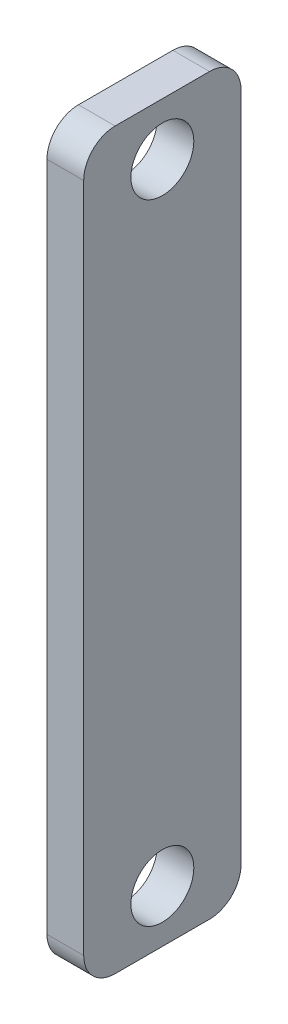
ISO-10303-21;
HEADER;
FILE_DESCRIPTION(('STEP AP214'),'2;1');
FILE_NAME('part.step','',(''),(''),'','','');
FILE_SCHEMA(('AUTOMOTIVE_DESIGN { 1 0 10303 214 1 1 1 1 }'));
ENDSEC;
DATA;
#1=APPLICATION_CONTEXT('core data for automotive mechanical design processes');
#2=APPLICATION_PROTOCOL_DEFINITION('international standard','automotive_design',2000,#1);
#3=PRODUCT_CONTEXT('',#1,'mechanical');
#4=PRODUCT('Part','Part','',(#3));
#5=PRODUCT_RELATED_PRODUCT_CATEGORY('part','',(#4));
#6=PRODUCT_DEFINITION_FORMATION('','',#4);
#7=PRODUCT_DEFINITION_CONTEXT('part definition',#1,'design');
#8=PRODUCT_DEFINITION('design','',#6,#7);
#9=PRODUCT_DEFINITION_SHAPE('','',#8);
#10=(LENGTH_UNIT() NAMED_UNIT(*) SI_UNIT(.MILLI.,.METRE.));
#11=(NAMED_UNIT(*) PLANE_ANGLE_UNIT() SI_UNIT($,.RADIAN.));
#12=(NAMED_UNIT(*) SI_UNIT($,.STERADIAN.) SOLID_ANGLE_UNIT());
#13=UNCERTAINTY_MEASURE_WITH_UNIT(LENGTH_MEASURE(1.E-05),#10,'distance_accuracy_value','');
#14=(GEOMETRIC_REPRESENTATION_CONTEXT(3) GLOBAL_UNCERTAINTY_ASSIGNED_CONTEXT((#13)) GLOBAL_UNIT_ASSIGNED_CONTEXT((#10,
#11,#12)) REPRESENTATION_CONTEXT('',''));
#15=CARTESIAN_POINT('',(0.,0.,0.));
#16=DIRECTION('',(0.,0.,1.));
#17=DIRECTION('',(1.,0.,0.));
#18=AXIS2_PLACEMENT_3D('',#15,#16,#17);
#19=CARTESIAN_POINT('',(1.75,-67.,-3.00000000000001));
#20=DIRECTION('',(1.,0.,0.));
#21=DIRECTION('',(0.,0.,-1.));
#22=AXIS2_PLACEMENT_3D('',#19,#20,#21);
#23=PLANE('',#22);
#24=CARTESIAN_POINT('',(1.75,-5.,-7.5));
#25=DIRECTION('',(1.,0.,0.));
#26=DIRECTION('',(0.,0.,-1.));
#27=AXIS2_PLACEMENT_3D('',#24,#25,#26);
#28=CIRCLE('',#27,3.);
#29=CARTESIAN_POINT('',(1.75,-5.,-10.5));
#30=VERTEX_POINT('',#29);
#31=EDGE_CURVE('E134',#30,#30,#28,.T.);
#32=ORIENTED_EDGE('',*,*,#31,.F.);
#33=EDGE_LOOP('',(#32));
#34=FACE_BOUND('',#33,.T.);
#35=CARTESIAN_POINT('',(1.75,-67.,-3.00000000000001));
#36=DIRECTION('',(1.,0.,0.));
#37=DIRECTION('',(0.,0.,-1.));
#38=AXIS2_PLACEMENT_3D('',#35,#36,#37);
#39=CIRCLE('',#38,3.);
#40=CARTESIAN_POINT('',(1.75,-67.,0.));
#41=VERTEX_POINT('',#40);
#42=CARTESIAN_POINT('',(1.75,-70.,-3.00000000000001));
#43=VERTEX_POINT('',#42);
#44=EDGE_CURVE('E145',#41,#43,#39,.T.);
#45=ORIENTED_EDGE('',*,*,#44,.T.);
#46=DIRECTION('',(0.,0.,-1.));
#47=VECTOR('',#46,1.);
#48=CARTESIAN_POINT('',(1.75,-70.,-3.00000000000001));
#49=LINE('',#48,#47);
#50=CARTESIAN_POINT('',(1.75,-70.,-12.));
#51=VERTEX_POINT('',#50);
#52=EDGE_CURVE('E93',#43,#51,#49,.T.);
#53=ORIENTED_EDGE('',*,*,#52,.T.);
#54=CARTESIAN_POINT('',(1.75,-67.,-12.));
#55=DIRECTION('',(1.,0.,0.));
#56=DIRECTION('',(0.,0.,-1.));
#57=AXIS2_PLACEMENT_3D('',#54,#55,#56);
#58=CIRCLE('',#57,3.);
#59=CARTESIAN_POINT('',(1.75,-67.,-15.));
#60=VERTEX_POINT('',#59);
#61=EDGE_CURVE('E160',#51,#60,#58,.T.);
#62=ORIENTED_EDGE('',*,*,#61,.T.);
#63=DIRECTION('',(0.,1.,0.));
#64=VECTOR('',#63,1.);
#65=CARTESIAN_POINT('',(1.75,-3.00000000000002,-15.));
#66=LINE('',#65,#64);
#67=CARTESIAN_POINT('',(1.75,-3.00000000000002,-15.));
#68=VERTEX_POINT('',#67);
#69=EDGE_CURVE('E173',#60,#68,#66,.T.);
#70=ORIENTED_EDGE('',*,*,#69,.T.);
#71=CARTESIAN_POINT('',(1.75,-3.,-12.));
#72=DIRECTION('',(1.,0.,0.));
#73=DIRECTION('',(0.,0.,1.));
#74=AXIS2_PLACEMENT_3D('',#71,#72,#73);
#75=CIRCLE('',#74,3.);
#76=CARTESIAN_POINT('',(1.75,0.,-12.));
#77=VERTEX_POINT('',#76);
#78=EDGE_CURVE('E112',#68,#77,#75,.T.);
#79=ORIENTED_EDGE('',*,*,#78,.T.);
#80=DIRECTION('',(0.,0.,1.));
#81=VECTOR('',#80,1.);
#82=CARTESIAN_POINT('',(1.75,0.,-3.00000000000002));
#83=LINE('',#82,#81);
#84=CARTESIAN_POINT('',(1.75,0.,-3.00000000000002));
#85=VERTEX_POINT('',#84);
#86=EDGE_CURVE('E106',#77,#85,#83,.T.);
#87=ORIENTED_EDGE('',*,*,#86,.T.);
#88=CARTESIAN_POINT('',(1.75,-3.,-3.));
#89=DIRECTION('',(1.,0.,0.));
#90=DIRECTION('',(0.,0.,-1.));
#91=AXIS2_PLACEMENT_3D('',#88,#89,#90);
#92=CIRCLE('',#91,3.);
#93=CARTESIAN_POINT('',(1.75,-3.00000000000002,0.));
#94=VERTEX_POINT('',#93);
#95=EDGE_CURVE('E110',#85,#94,#92,.T.);
#96=ORIENTED_EDGE('',*,*,#95,.T.);
#97=DIRECTION('',(0.,-1.,0.));
#98=VECTOR('',#97,1.);
#99=CARTESIAN_POINT('',(1.75,-3.00000000000002,0.));
#100=LINE('',#99,#98);
#101=EDGE_CURVE('E50',#94,#41,#100,.T.);
#102=ORIENTED_EDGE('',*,*,#101,.T.);
#103=EDGE_LOOP('',(#45,#53,#62,#70,#79,#87,#96,#102));
#104=FACE_BOUND('',#103,.T.);
#105=CARTESIAN_POINT('',(1.75,-65.,-7.50000000000003));
#106=DIRECTION('',(1.,0.,0.));
#107=DIRECTION('',(0.,0.,-1.));
#108=AXIS2_PLACEMENT_3D('',#105,#106,#107);
#109=CIRCLE('',#108,3.);
#110=CARTESIAN_POINT('',(1.75,-65.,-10.5));
#111=VERTEX_POINT('',#110);
#112=EDGE_CURVE('E182',#111,#111,#109,.T.);
#113=ORIENTED_EDGE('',*,*,#112,.F.);
#114=EDGE_LOOP('',(#113));
#115=FACE_BOUND('',#114,.T.);
#116=ADVANCED_FACE('F33',(#34,#104,#115),#23,.T.);
#117=CARTESIAN_POINT('',(-1.75,-67.,-3.00000000000001));
#118=DIRECTION('',(1.,0.,0.));
#119=DIRECTION('',(0.,0.,-1.));
#120=AXIS2_PLACEMENT_3D('',#117,#118,#119);
#121=PLANE('',#120);
#122=CARTESIAN_POINT('',(-1.75,-67.,-3.00000000000001));
#123=DIRECTION('',(1.,0.,0.));
#124=DIRECTION('',(0.,0.,-1.));
#125=AXIS2_PLACEMENT_3D('',#122,#123,#124);
#126=CIRCLE('',#125,3.);
#127=CARTESIAN_POINT('',(-1.75,-67.,0.));
#128=VERTEX_POINT('',#127);
#129=CARTESIAN_POINT('',(-1.75,-70.,-3.00000000000001));
#130=VERTEX_POINT('',#129);
#131=EDGE_CURVE('E130',#128,#130,#126,.T.);
#132=ORIENTED_EDGE('',*,*,#131,.F.);
#133=DIRECTION('',(0.,-1.,0.));
#134=VECTOR('',#133,1.);
#135=CARTESIAN_POINT('',(-1.75,-3.00000000000002,0.));
#136=LINE('',#135,#134);
#137=CARTESIAN_POINT('',(-1.75,-3.00000000000002,0.));
#138=VERTEX_POINT('',#137);
#139=EDGE_CURVE('E85',#138,#128,#136,.T.);
#140=ORIENTED_EDGE('',*,*,#139,.F.);
#141=CARTESIAN_POINT('',(-1.75,-3.,-3.));
#142=DIRECTION('',(1.,0.,0.));
#143=DIRECTION('',(0.,0.,-1.));
#144=AXIS2_PLACEMENT_3D('',#141,#142,#143);
#145=CIRCLE('',#144,3.);
#146=CARTESIAN_POINT('',(-1.75,0.,-3.00000000000002));
#147=VERTEX_POINT('',#146);
#148=EDGE_CURVE('E79',#147,#138,#145,.T.);
#149=ORIENTED_EDGE('',*,*,#148,.F.);
#150=DIRECTION('',(0.,0.,1.));
#151=VECTOR('',#150,1.);
#152=CARTESIAN_POINT('',(-1.75,0.,-3.00000000000002));
#153=LINE('',#152,#151);
#154=CARTESIAN_POINT('',(-1.75,0.,-12.));
#155=VERTEX_POINT('',#154);
#156=EDGE_CURVE('E120',#155,#147,#153,.T.);
#157=ORIENTED_EDGE('',*,*,#156,.F.);
#158=CARTESIAN_POINT('',(-1.75,-3.,-12.));
#159=DIRECTION('',(1.,0.,0.));
#160=DIRECTION('',(0.,0.,1.));
#161=AXIS2_PLACEMENT_3D('',#158,#159,#160);
#162=CIRCLE('',#161,3.);
#163=CARTESIAN_POINT('',(-1.75,-3.00000000000002,-15.));
#164=VERTEX_POINT('',#163);
#165=EDGE_CURVE('E140',#164,#155,#162,.T.);
#166=ORIENTED_EDGE('',*,*,#165,.F.);
#167=DIRECTION('',(0.,1.,0.));
#168=VECTOR('',#167,1.);
#169=CARTESIAN_POINT('',(-1.75,-3.00000000000002,-15.));
#170=LINE('',#169,#168);
#171=CARTESIAN_POINT('',(-1.75,-67.,-15.));
#172=VERTEX_POINT('',#171);
#173=EDGE_CURVE('E138',#172,#164,#170,.T.);
#174=ORIENTED_EDGE('',*,*,#173,.F.);
#175=CARTESIAN_POINT('',(-1.75,-67.,-12.));
#176=DIRECTION('',(1.,0.,0.));
#177=DIRECTION('',(0.,0.,-1.));
#178=AXIS2_PLACEMENT_3D('',#175,#176,#177);
#179=CIRCLE('',#178,3.);
#180=CARTESIAN_POINT('',(-1.75,-70.,-12.));
#181=VERTEX_POINT('',#180);
#182=EDGE_CURVE('E136',#181,#172,#179,.T.);
#183=ORIENTED_EDGE('',*,*,#182,.F.);
#184=DIRECTION('',(0.,0.,-1.));
#185=VECTOR('',#184,1.);
#186=CARTESIAN_POINT('',(-1.75,-70.,-3.00000000000001));
#187=LINE('',#186,#185);
#188=EDGE_CURVE('E133',#130,#181,#187,.T.);
#189=ORIENTED_EDGE('',*,*,#188,.F.);
#190=EDGE_LOOP('',(#132,#140,#149,#157,#166,#174,#183,#189));
#191=FACE_BOUND('',#190,.T.);
#192=CARTESIAN_POINT('',(-1.75,-5.,-7.5));
#193=DIRECTION('',(1.,0.,0.));
#194=DIRECTION('',(0.,0.,-1.));
#195=AXIS2_PLACEMENT_3D('',#192,#193,#194);
#196=CIRCLE('',#195,3.);
#197=CARTESIAN_POINT('',(-1.75,-5.,-10.5));
#198=VERTEX_POINT('',#197);
#199=EDGE_CURVE('E179',#198,#198,#196,.T.);
#200=ORIENTED_EDGE('',*,*,#199,.T.);
#201=EDGE_LOOP('',(#200));
#202=FACE_BOUND('',#201,.T.);
#203=CARTESIAN_POINT('',(-1.75,-65.,-7.50000000000003));
#204=DIRECTION('',(1.,0.,0.));
#205=DIRECTION('',(0.,0.,-1.));
#206=AXIS2_PLACEMENT_3D('',#203,#204,#205);
#207=CIRCLE('',#206,3.);
#208=CARTESIAN_POINT('',(-1.75,-65.,-10.5));
#209=VERTEX_POINT('',#208);
#210=EDGE_CURVE('E185',#209,#209,#207,.T.);
#211=ORIENTED_EDGE('',*,*,#210,.T.);
#212=EDGE_LOOP('',(#211));
#213=FACE_BOUND('',#212,.T.);
#214=ADVANCED_FACE('F164',(#191,#202,#213),#121,.F.);
#215=CARTESIAN_POINT('',(1.75,-67.,-3.00000000000001));
#216=DIRECTION('',(-1.,0.,0.));
#217=DIRECTION('',(0.,0.,1.));
#218=AXIS2_PLACEMENT_3D('',#215,#216,#217);
#219=CYLINDRICAL_SURFACE('',#218,3.);
#220=ORIENTED_EDGE('',*,*,#131,.T.);
#221=DIRECTION('',(-1.,0.,0.));
#222=VECTOR('',#221,1.);
#223=CARTESIAN_POINT('',(1.75,-70.,-3.00000000000001));
#224=LINE('',#223,#222);
#225=EDGE_CURVE('E11',#43,#130,#224,.T.);
#226=ORIENTED_EDGE('',*,*,#225,.F.);
#227=ORIENTED_EDGE('',*,*,#44,.F.);
#228=DIRECTION('',(-1.,0.,0.));
#229=VECTOR('',#228,1.);
#230=CARTESIAN_POINT('',(1.75,-67.,0.));
#231=LINE('',#230,#229);
#232=EDGE_CURVE('E126',#41,#128,#231,.T.);
#233=ORIENTED_EDGE('',*,*,#232,.T.);
#234=EDGE_LOOP('',(#220,#226,#227,#233));
#235=FACE_BOUND('',#234,.T.);
#236=ADVANCED_FACE('F35',(#235),#219,.T.);
#237=CARTESIAN_POINT('',(1.75,-70.,-3.00000000000001));
#238=DIRECTION('',(0.,1.,0.));
#239=DIRECTION('',(0.,0.,1.));
#240=AXIS2_PLACEMENT_3D('',#237,#238,#239);
#241=PLANE('',#240);
#242=ORIENTED_EDGE('',*,*,#188,.T.);
#243=DIRECTION('',(-1.,0.,0.));
#244=VECTOR('',#243,1.);
#245=CARTESIAN_POINT('',(1.75,-70.,-12.));
#246=LINE('',#245,#244);
#247=EDGE_CURVE('E42',#51,#181,#246,.T.);
#248=ORIENTED_EDGE('',*,*,#247,.F.);
#249=ORIENTED_EDGE('',*,*,#52,.F.);
#250=ORIENTED_EDGE('',*,*,#225,.T.);
#251=EDGE_LOOP('',(#242,#248,#249,#250));
#252=FACE_BOUND('',#251,.T.);
#253=ADVANCED_FACE('F217',(#252),#241,.F.);
#254=CARTESIAN_POINT('',(1.75,-67.,-12.));
#255=DIRECTION('',(-1.,0.,0.));
#256=DIRECTION('',(0.,0.,1.));
#257=AXIS2_PLACEMENT_3D('',#254,#255,#256);
#258=CYLINDRICAL_SURFACE('',#257,3.);
#259=ORIENTED_EDGE('',*,*,#182,.T.);
#260=DIRECTION('',(-1.,0.,0.));
#261=VECTOR('',#260,1.);
#262=CARTESIAN_POINT('',(1.75,-67.,-15.));
#263=LINE('',#262,#261);
#264=EDGE_CURVE('E152',#60,#172,#263,.T.);
#265=ORIENTED_EDGE('',*,*,#264,.F.);
#266=ORIENTED_EDGE('',*,*,#61,.F.);
#267=ORIENTED_EDGE('',*,*,#247,.T.);
#268=EDGE_LOOP('',(#259,#265,#266,#267));
#269=FACE_BOUND('',#268,.T.);
#270=ADVANCED_FACE('F158',(#269),#258,.T.);
#271=CARTESIAN_POINT('',(1.75,-3.00000000000002,-15.));
#272=DIRECTION('',(0.,0.,1.));
#273=DIRECTION('',(0.,-1.,0.));
#274=AXIS2_PLACEMENT_3D('',#271,#272,#273);
#275=PLANE('',#274);
#276=ORIENTED_EDGE('',*,*,#173,.T.);
#277=DIRECTION('',(-1.,0.,0.));
#278=VECTOR('',#277,1.);
#279=CARTESIAN_POINT('',(1.75,-3.00000000000002,-15.));
#280=LINE('',#279,#278);
#281=EDGE_CURVE('E149',#68,#164,#280,.T.);
#282=ORIENTED_EDGE('',*,*,#281,.F.);
#283=ORIENTED_EDGE('',*,*,#69,.F.);
#284=ORIENTED_EDGE('',*,*,#264,.T.);
#285=EDGE_LOOP('',(#276,#282,#283,#284));
#286=FACE_BOUND('',#285,.T.);
#287=ADVANCED_FACE('F169',(#286),#275,.F.);
#288=CARTESIAN_POINT('',(1.75,-3.,-12.));
#289=DIRECTION('',(-1.,0.,0.));
#290=DIRECTION('',(0.,0.,1.));
#291=AXIS2_PLACEMENT_3D('',#288,#289,#290);
#292=CYLINDRICAL_SURFACE('',#291,3.);
#293=ORIENTED_EDGE('',*,*,#165,.T.);
#294=DIRECTION('',(-1.,0.,0.));
#295=VECTOR('',#294,1.);
#296=CARTESIAN_POINT('',(1.75,0.,-12.));
#297=LINE('',#296,#295);
#298=EDGE_CURVE('E121',#77,#155,#297,.T.);
#299=ORIENTED_EDGE('',*,*,#298,.F.);
#300=ORIENTED_EDGE('',*,*,#78,.F.);
#301=ORIENTED_EDGE('',*,*,#281,.T.);
#302=EDGE_LOOP('',(#293,#299,#300,#301));
#303=FACE_BOUND('',#302,.T.);
#304=ADVANCED_FACE('F172',(#303),#292,.T.);
#305=CARTESIAN_POINT('',(1.75,0.,-3.00000000000002));
#306=DIRECTION('',(0.,-1.,0.));
#307=DIRECTION('',(0.,0.,-1.));
#308=AXIS2_PLACEMENT_3D('',#305,#306,#307);
#309=PLANE('',#308);
#310=ORIENTED_EDGE('',*,*,#156,.T.);
#311=DIRECTION('',(-1.,0.,0.));
#312=VECTOR('',#311,1.);
#313=CARTESIAN_POINT('',(1.75,0.,-3.00000000000002));
#314=LINE('',#313,#312);
#315=EDGE_CURVE('E117',#85,#147,#314,.T.);
#316=ORIENTED_EDGE('',*,*,#315,.F.);
#317=ORIENTED_EDGE('',*,*,#86,.F.);
#318=ORIENTED_EDGE('',*,*,#298,.T.);
#319=EDGE_LOOP('',(#310,#316,#317,#318));
#320=FACE_BOUND('',#319,.T.);
#321=ADVANCED_FACE('F118',(#320),#309,.F.);
#322=CARTESIAN_POINT('',(1.75,-3.,-3.));
#323=DIRECTION('',(-1.,0.,0.));
#324=DIRECTION('',(0.,0.,1.));
#325=AXIS2_PLACEMENT_3D('',#322,#323,#324);
#326=CYLINDRICAL_SURFACE('',#325,3.);
#327=ORIENTED_EDGE('',*,*,#148,.T.);
#328=DIRECTION('',(-1.,0.,0.));
#329=VECTOR('',#328,1.);
#330=CARTESIAN_POINT('',(1.75,-3.00000000000002,0.));
#331=LINE('',#330,#329);
#332=EDGE_CURVE('E122',#94,#138,#331,.T.);
#333=ORIENTED_EDGE('',*,*,#332,.F.);
#334=ORIENTED_EDGE('',*,*,#95,.F.);
#335=ORIENTED_EDGE('',*,*,#315,.T.);
#336=EDGE_LOOP('',(#327,#333,#334,#335));
#337=FACE_BOUND('',#336,.T.);
#338=ADVANCED_FACE('F124',(#337),#326,.T.);
#339=CARTESIAN_POINT('',(1.75,-3.00000000000002,0.));
#340=DIRECTION('',(0.,0.,-1.));
#341=DIRECTION('',(0.,1.,0.));
#342=AXIS2_PLACEMENT_3D('',#339,#340,#341);
#343=PLANE('',#342);
#344=ORIENTED_EDGE('',*,*,#139,.T.);
#345=ORIENTED_EDGE('',*,*,#232,.F.);
#346=ORIENTED_EDGE('',*,*,#101,.F.);
#347=ORIENTED_EDGE('',*,*,#332,.T.);
#348=EDGE_LOOP('',(#344,#345,#346,#347));
#349=FACE_BOUND('',#348,.T.);
#350=ADVANCED_FACE('F205',(#349),#343,.F.);
#351=CARTESIAN_POINT('',(1.75,-5.,-7.5));
#352=DIRECTION('',(-1.,0.,0.));
#353=DIRECTION('',(0.,0.,1.));
#354=AXIS2_PLACEMENT_3D('',#351,#352,#353);
#355=CYLINDRICAL_SURFACE('',#354,3.);
#356=ORIENTED_EDGE('',*,*,#31,.T.);
#357=EDGE_LOOP('',(#356));
#358=FACE_BOUND('',#357,.T.);
#359=ORIENTED_EDGE('',*,*,#199,.F.);
#360=EDGE_LOOP('',(#359));
#361=FACE_BOUND('',#360,.T.);
#362=ADVANCED_FACE('F202',(#358,#361),#355,.F.);
#363=CARTESIAN_POINT('',(1.75,-65.,-7.50000000000003));
#364=DIRECTION('',(-1.,0.,0.));
#365=DIRECTION('',(0.,0.,1.));
#366=AXIS2_PLACEMENT_3D('',#363,#364,#365);
#367=CYLINDRICAL_SURFACE('',#366,3.);
#368=ORIENTED_EDGE('',*,*,#112,.T.);
#369=EDGE_LOOP('',(#368));
#370=FACE_BOUND('',#369,.T.);
#371=ORIENTED_EDGE('',*,*,#210,.F.);
#372=EDGE_LOOP('',(#371));
#373=FACE_BOUND('',#372,.T.);
#374=ADVANCED_FACE('F191',(#370,#373),#367,.F.);
#375=CLOSED_SHELL('',(#116,#214,#236,#253,#270,#287,#304,#321,#338,#350,#362,#374));
#376=MANIFOLD_SOLID_BREP('B2',#375);
#377=ADVANCED_BREP_SHAPE_REPRESENTATION('',(#18,#376),#14);
#378=SHAPE_DEFINITION_REPRESENTATION(#9,#377);
ENDSEC;
END-ISO-10303-21;
